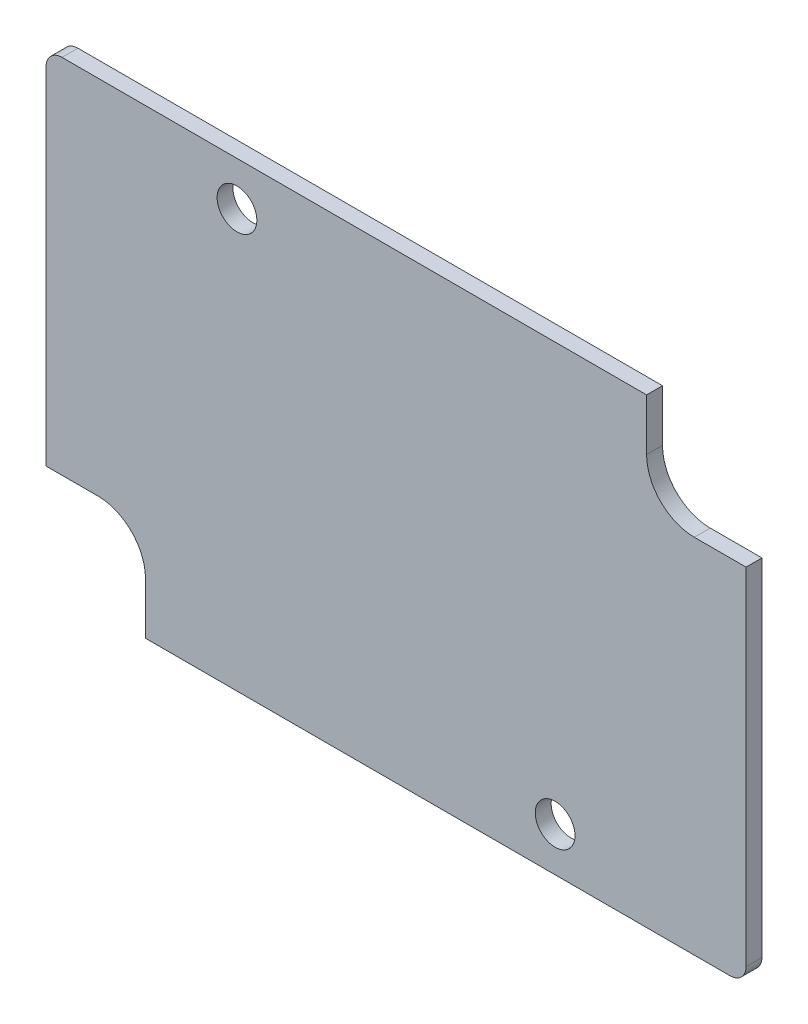
ISO-10303-21;
HEADER;
FILE_DESCRIPTION(('STEP AP214'),'2;1');
FILE_NAME('part.step','',(''),(''),'','','');
FILE_SCHEMA(('AUTOMOTIVE_DESIGN { 1 0 10303 214 1 1 1 1 }'));
ENDSEC;
DATA;
#1=APPLICATION_CONTEXT('core data for automotive mechanical design processes');
#2=APPLICATION_PROTOCOL_DEFINITION('international standard','automotive_design',2000,#1);
#3=PRODUCT_CONTEXT('',#1,'mechanical');
#4=PRODUCT('Part','Part','',(#3));
#5=PRODUCT_RELATED_PRODUCT_CATEGORY('part','',(#4));
#6=PRODUCT_DEFINITION_FORMATION('','',#4);
#7=PRODUCT_DEFINITION_CONTEXT('part definition',#1,'design');
#8=PRODUCT_DEFINITION('design','',#6,#7);
#9=PRODUCT_DEFINITION_SHAPE('','',#8);
#10=(LENGTH_UNIT() NAMED_UNIT(*) SI_UNIT(.MILLI.,.METRE.));
#11=(NAMED_UNIT(*) PLANE_ANGLE_UNIT() SI_UNIT($,.RADIAN.));
#12=(NAMED_UNIT(*) SI_UNIT($,.STERADIAN.) SOLID_ANGLE_UNIT());
#13=UNCERTAINTY_MEASURE_WITH_UNIT(LENGTH_MEASURE(1.E-05),#10,'distance_accuracy_value','');
#14=(GEOMETRIC_REPRESENTATION_CONTEXT(3) GLOBAL_UNCERTAINTY_ASSIGNED_CONTEXT((#13)) GLOBAL_UNIT_ASSIGNED_CONTEXT((#10,
#11,#12)) REPRESENTATION_CONTEXT('',''));
#15=CARTESIAN_POINT('',(0.,0.,0.));
#16=DIRECTION('',(0.,0.,1.));
#17=DIRECTION('',(1.,0.,0.));
#18=AXIS2_PLACEMENT_3D('',#15,#16,#17);
#19=CARTESIAN_POINT('',(0.,0.,1.));
#20=DIRECTION('',(0.,0.,1.));
#21=DIRECTION('',(1.,0.,0.));
#22=AXIS2_PLACEMENT_3D('',#19,#20,#21);
#23=PLANE('',#22);
#24=CARTESIAN_POINT('',(10.,-11.75,1.));
#25=DIRECTION('',(0.,0.,1.));
#26=DIRECTION('',(1.,0.,0.));
#27=AXIS2_PLACEMENT_3D('',#24,#25,#26);
#28=CIRCLE('',#27,1.25);
#29=CARTESIAN_POINT('',(11.25,-11.75,1.));
#30=VERTEX_POINT('',#29);
#31=EDGE_CURVE('E185',#30,#30,#28,.F.);
#32=ORIENTED_EDGE('',*,*,#31,.T.);
#33=EDGE_LOOP('',(#32));
#34=FACE_BOUND('',#33,.T.);
#35=CARTESIAN_POINT('',(-10.,11.75,1.));
#36=DIRECTION('',(0.,0.,1.));
#37=DIRECTION('',(1.,0.,0.));
#38=AXIS2_PLACEMENT_3D('',#35,#36,#37);
#39=CIRCLE('',#38,1.25);
#40=CARTESIAN_POINT('',(-8.75,11.75,1.));
#41=VERTEX_POINT('',#40);
#42=EDGE_CURVE('E188',#41,#41,#39,.F.);
#43=ORIENTED_EDGE('',*,*,#42,.T.);
#44=EDGE_LOOP('',(#43));
#45=FACE_BOUND('',#44,.T.);
#46=DIRECTION('',(-1.,0.,0.));
#47=VECTOR('',#46,1.);
#48=CARTESIAN_POINT('',(18.75,8.25,1.));
#49=LINE('',#48,#47);
#50=CARTESIAN_POINT('',(18.75,8.25,1.));
#51=VERTEX_POINT('',#50);
#52=CARTESIAN_POINT('',(22.,8.25,1.));
#53=VERTEX_POINT('',#52);
#54=EDGE_CURVE('E139',#51,#53,#49,.F.);
#55=ORIENTED_EDGE('',*,*,#54,.F.);
#56=CARTESIAN_POINT('',(18.75,11.25,1.));
#57=DIRECTION('',(0.,0.,1.));
#58=DIRECTION('',(1.,0.,0.));
#59=AXIS2_PLACEMENT_3D('',#56,#57,#58);
#60=CIRCLE('',#59,3.);
#61=CARTESIAN_POINT('',(15.75,11.25,1.));
#62=VERTEX_POINT('',#61);
#63=EDGE_CURVE('E136',#51,#62,#60,.F.);
#64=ORIENTED_EDGE('',*,*,#63,.T.);
#65=DIRECTION('',(0.,1.,0.));
#66=VECTOR('',#65,1.);
#67=CARTESIAN_POINT('',(15.75,14.5,1.));
#68=LINE('',#67,#66);
#69=CARTESIAN_POINT('',(15.75,14.5,1.));
#70=VERTEX_POINT('',#69);
#71=EDGE_CURVE('E134',#70,#62,#68,.F.);
#72=ORIENTED_EDGE('',*,*,#71,.F.);
#73=DIRECTION('',(1.,0.,0.));
#74=VECTOR('',#73,1.);
#75=CARTESIAN_POINT('',(-21.,14.5,1.));
#76=LINE('',#75,#74);
#77=CARTESIAN_POINT('',(-21.,14.5,1.));
#78=VERTEX_POINT('',#77);
#79=EDGE_CURVE('E116',#78,#70,#76,.T.);
#80=ORIENTED_EDGE('',*,*,#79,.F.);
#81=CARTESIAN_POINT('',(-21.,13.5,1.));
#82=DIRECTION('',(0.,0.,1.));
#83=DIRECTION('',(1.,0.,0.));
#84=AXIS2_PLACEMENT_3D('',#81,#82,#83);
#85=CIRCLE('',#84,1.);
#86=CARTESIAN_POINT('',(-22.,13.5,1.));
#87=VERTEX_POINT('',#86);
#88=EDGE_CURVE('E20',#87,#78,#85,.F.);
#89=ORIENTED_EDGE('',*,*,#88,.F.);
#90=DIRECTION('',(0.,-1.,0.));
#91=VECTOR('',#90,1.);
#92=CARTESIAN_POINT('',(-22.,-8.25,1.));
#93=LINE('',#92,#91);
#94=CARTESIAN_POINT('',(-22.,-8.25,1.));
#95=VERTEX_POINT('',#94);
#96=EDGE_CURVE('E103',#95,#87,#93,.F.);
#97=ORIENTED_EDGE('',*,*,#96,.F.);
#98=DIRECTION('',(1.,0.,0.));
#99=VECTOR('',#98,1.);
#100=CARTESIAN_POINT('',(-18.75,-8.25,1.));
#101=LINE('',#100,#99);
#102=CARTESIAN_POINT('',(-18.75,-8.25,1.));
#103=VERTEX_POINT('',#102);
#104=EDGE_CURVE('E123',#103,#95,#101,.F.);
#105=ORIENTED_EDGE('',*,*,#104,.F.);
#106=CARTESIAN_POINT('',(-18.75,-11.25,1.));
#107=DIRECTION('',(0.,0.,1.));
#108=DIRECTION('',(1.,0.,0.));
#109=AXIS2_PLACEMENT_3D('',#106,#107,#108);
#110=CIRCLE('',#109,3.);
#111=CARTESIAN_POINT('',(-15.75,-11.25,1.));
#112=VERTEX_POINT('',#111);
#113=EDGE_CURVE('E158',#103,#112,#110,.F.);
#114=ORIENTED_EDGE('',*,*,#113,.T.);
#115=DIRECTION('',(0.,-1.,0.));
#116=VECTOR('',#115,1.);
#117=CARTESIAN_POINT('',(-15.75,-14.5,1.));
#118=LINE('',#117,#116);
#119=CARTESIAN_POINT('',(-15.75,-14.5,1.));
#120=VERTEX_POINT('',#119);
#121=EDGE_CURVE('E156',#120,#112,#118,.F.);
#122=ORIENTED_EDGE('',*,*,#121,.F.);
#123=DIRECTION('',(1.,0.,0.));
#124=VECTOR('',#123,1.);
#125=CARTESIAN_POINT('',(21.,-14.5,1.));
#126=LINE('',#125,#124);
#127=CARTESIAN_POINT('',(21.,-14.5,1.));
#128=VERTEX_POINT('',#127);
#129=EDGE_CURVE('E150',#128,#120,#126,.F.);
#130=ORIENTED_EDGE('',*,*,#129,.F.);
#131=CARTESIAN_POINT('',(21.,-13.5,1.));
#132=DIRECTION('',(0.,0.,1.));
#133=DIRECTION('',(1.,0.,0.));
#134=AXIS2_PLACEMENT_3D('',#131,#132,#133);
#135=CIRCLE('',#134,1.);
#136=CARTESIAN_POINT('',(22.,-13.5,1.));
#137=VERTEX_POINT('',#136);
#138=EDGE_CURVE('E195',#137,#128,#135,.F.);
#139=ORIENTED_EDGE('',*,*,#138,.F.);
#140=DIRECTION('',(0.,1.,0.));
#141=VECTOR('',#140,1.);
#142=CARTESIAN_POINT('',(22.,8.25,1.));
#143=LINE('',#142,#141);
#144=EDGE_CURVE('E145',#53,#137,#143,.F.);
#145=ORIENTED_EDGE('',*,*,#144,.F.);
#146=EDGE_LOOP('',(#55,#64,#72,#80,#89,#97,#105,#114,#122,#130,#139,#145));
#147=FACE_BOUND('',#146,.T.);
#148=ADVANCED_FACE('F17',(#34,#45,#147),#23,.T.);
#149=CARTESIAN_POINT('',(-21.,13.5,0.));
#150=DIRECTION('',(0.,0.,1.));
#151=DIRECTION('',(1.,0.,0.));
#152=AXIS2_PLACEMENT_3D('',#149,#150,#151);
#153=CYLINDRICAL_SURFACE('',#152,1.);
#154=CARTESIAN_POINT('',(-21.,13.5,0.));
#155=DIRECTION('',(0.,0.,1.));
#156=DIRECTION('',(1.,0.,0.));
#157=AXIS2_PLACEMENT_3D('',#154,#155,#156);
#158=CIRCLE('',#157,1.);
#159=CARTESIAN_POINT('',(-21.,14.5,0.));
#160=VERTEX_POINT('',#159);
#161=CARTESIAN_POINT('',(-22.,13.5,0.));
#162=VERTEX_POINT('',#161);
#163=EDGE_CURVE('E122',#160,#162,#158,.T.);
#164=ORIENTED_EDGE('',*,*,#163,.T.);
#165=DIRECTION('',(0.,0.,1.));
#166=VECTOR('',#165,1.);
#167=CARTESIAN_POINT('',(-22.,13.5,0.));
#168=LINE('',#167,#166);
#169=EDGE_CURVE('E108',#87,#162,#168,.F.);
#170=ORIENTED_EDGE('',*,*,#169,.F.);
#171=ORIENTED_EDGE('',*,*,#88,.T.);
#172=DIRECTION('',(0.,0.,1.));
#173=VECTOR('',#172,1.);
#174=CARTESIAN_POINT('',(-21.,14.5,0.));
#175=LINE('',#174,#173);
#176=EDGE_CURVE('E191',#160,#78,#175,.T.);
#177=ORIENTED_EDGE('',*,*,#176,.F.);
#178=EDGE_LOOP('',(#164,#170,#171,#177));
#179=FACE_BOUND('',#178,.T.);
#180=ADVANCED_FACE('F121',(#179),#153,.T.);
#181=CARTESIAN_POINT('',(-22.,-8.25,0.));
#182=DIRECTION('',(-1.,0.,0.));
#183=DIRECTION('',(0.,-1.,0.));
#184=AXIS2_PLACEMENT_3D('',#181,#182,#183);
#185=PLANE('',#184);
#186=DIRECTION('',(0.,1.,0.));
#187=VECTOR('',#186,1.);
#188=CARTESIAN_POINT('',(-22.,0.,0.));
#189=LINE('',#188,#187);
#190=CARTESIAN_POINT('',(-22.,-8.25,0.));
#191=VERTEX_POINT('',#190);
#192=EDGE_CURVE('E184',#162,#191,#189,.F.);
#193=ORIENTED_EDGE('',*,*,#192,.T.);
#194=DIRECTION('',(0.,0.,1.));
#195=VECTOR('',#194,1.);
#196=CARTESIAN_POINT('',(-22.,-8.25,0.));
#197=LINE('',#196,#195);
#198=EDGE_CURVE('E110',#95,#191,#197,.F.);
#199=ORIENTED_EDGE('',*,*,#198,.F.);
#200=ORIENTED_EDGE('',*,*,#96,.T.);
#201=ORIENTED_EDGE('',*,*,#169,.T.);
#202=EDGE_LOOP('',(#193,#199,#200,#201));
#203=FACE_BOUND('',#202,.T.);
#204=ADVANCED_FACE('F106',(#203),#185,.T.);
#205=CARTESIAN_POINT('',(-18.75,-8.25,0.));
#206=DIRECTION('',(0.,-1.,0.));
#207=DIRECTION('',(1.,0.,0.));
#208=AXIS2_PLACEMENT_3D('',#205,#206,#207);
#209=PLANE('',#208);
#210=DIRECTION('',(1.,0.,0.));
#211=VECTOR('',#210,1.);
#212=CARTESIAN_POINT('',(0.,-8.25,0.));
#213=LINE('',#212,#211);
#214=CARTESIAN_POINT('',(-18.75,-8.25,0.));
#215=VERTEX_POINT('',#214);
#216=EDGE_CURVE('E182',#191,#215,#213,.T.);
#217=ORIENTED_EDGE('',*,*,#216,.T.);
#218=DIRECTION('',(0.,0.,1.));
#219=VECTOR('',#218,1.);
#220=CARTESIAN_POINT('',(-18.75,-8.25,0.));
#221=LINE('',#220,#219);
#222=EDGE_CURVE('E197',#215,#103,#221,.T.);
#223=ORIENTED_EDGE('',*,*,#222,.T.);
#224=ORIENTED_EDGE('',*,*,#104,.T.);
#225=ORIENTED_EDGE('',*,*,#198,.T.);
#226=EDGE_LOOP('',(#217,#223,#224,#225));
#227=FACE_BOUND('',#226,.T.);
#228=ADVANCED_FACE('F287',(#227),#209,.T.);
#229=CARTESIAN_POINT('',(-18.75,-11.25,0.));
#230=DIRECTION('',(0.,0.,1.));
#231=DIRECTION('',(1.,0.,0.));
#232=AXIS2_PLACEMENT_3D('',#229,#230,#231);
#233=CYLINDRICAL_SURFACE('',#232,3.);
#234=ORIENTED_EDGE('',*,*,#222,.F.);
#235=CARTESIAN_POINT('',(-18.75,-11.25,0.));
#236=DIRECTION('',(0.,0.,1.));
#237=DIRECTION('',(1.,0.,0.));
#238=AXIS2_PLACEMENT_3D('',#235,#236,#237);
#239=CIRCLE('',#238,3.);
#240=CARTESIAN_POINT('',(-15.75,-11.25,0.));
#241=VERTEX_POINT('',#240);
#242=EDGE_CURVE('E178',#215,#241,#239,.F.);
#243=ORIENTED_EDGE('',*,*,#242,.T.);
#244=DIRECTION('',(0.,0.,1.));
#245=VECTOR('',#244,1.);
#246=CARTESIAN_POINT('',(-15.75,-11.25,0.));
#247=LINE('',#246,#245);
#248=EDGE_CURVE('E153',#112,#241,#247,.F.);
#249=ORIENTED_EDGE('',*,*,#248,.F.);
#250=ORIENTED_EDGE('',*,*,#113,.F.);
#251=EDGE_LOOP('',(#234,#243,#249,#250));
#252=FACE_BOUND('',#251,.T.);
#253=ADVANCED_FACE('F285',(#252),#233,.F.);
#254=CARTESIAN_POINT('',(-15.75,-14.5,0.));
#255=DIRECTION('',(-1.,0.,0.));
#256=DIRECTION('',(0.,-1.,0.));
#257=AXIS2_PLACEMENT_3D('',#254,#255,#256);
#258=PLANE('',#257);
#259=DIRECTION('',(0.,1.,0.));
#260=VECTOR('',#259,1.);
#261=CARTESIAN_POINT('',(-15.75,0.,0.));
#262=LINE('',#261,#260);
#263=CARTESIAN_POINT('',(-15.75,-14.5,0.));
#264=VERTEX_POINT('',#263);
#265=EDGE_CURVE('E181',#241,#264,#262,.F.);
#266=ORIENTED_EDGE('',*,*,#265,.T.);
#267=DIRECTION('',(0.,0.,1.));
#268=VECTOR('',#267,1.);
#269=CARTESIAN_POINT('',(-15.75,-14.5,0.));
#270=LINE('',#269,#268);
#271=EDGE_CURVE('E152',#120,#264,#270,.F.);
#272=ORIENTED_EDGE('',*,*,#271,.F.);
#273=ORIENTED_EDGE('',*,*,#121,.T.);
#274=ORIENTED_EDGE('',*,*,#248,.T.);
#275=EDGE_LOOP('',(#266,#272,#273,#274));
#276=FACE_BOUND('',#275,.T.);
#277=ADVANCED_FACE('F283',(#276),#258,.T.);
#278=CARTESIAN_POINT('',(21.,-14.5,0.));
#279=DIRECTION('',(0.,-1.,0.));
#280=DIRECTION('',(1.,0.,0.));
#281=AXIS2_PLACEMENT_3D('',#278,#279,#280);
#282=PLANE('',#281);
#283=DIRECTION('',(1.,0.,0.));
#284=VECTOR('',#283,1.);
#285=CARTESIAN_POINT('',(0.,-14.5,0.));
#286=LINE('',#285,#284);
#287=CARTESIAN_POINT('',(21.,-14.5,0.));
#288=VERTEX_POINT('',#287);
#289=EDGE_CURVE('E177',#264,#288,#286,.T.);
#290=ORIENTED_EDGE('',*,*,#289,.T.);
#291=DIRECTION('',(0.,0.,1.));
#292=VECTOR('',#291,1.);
#293=CARTESIAN_POINT('',(21.,-14.5,0.));
#294=LINE('',#293,#292);
#295=EDGE_CURVE('E147',#128,#288,#294,.F.);
#296=ORIENTED_EDGE('',*,*,#295,.F.);
#297=ORIENTED_EDGE('',*,*,#129,.T.);
#298=ORIENTED_EDGE('',*,*,#271,.T.);
#299=EDGE_LOOP('',(#290,#296,#297,#298));
#300=FACE_BOUND('',#299,.T.);
#301=ADVANCED_FACE('F278',(#300),#282,.T.);
#302=CARTESIAN_POINT('',(21.,-13.5,0.));
#303=DIRECTION('',(0.,0.,1.));
#304=DIRECTION('',(1.,0.,0.));
#305=AXIS2_PLACEMENT_3D('',#302,#303,#304);
#306=CYLINDRICAL_SURFACE('',#305,1.);
#307=CARTESIAN_POINT('',(21.,-13.5,0.));
#308=DIRECTION('',(0.,0.,1.));
#309=DIRECTION('',(1.,0.,0.));
#310=AXIS2_PLACEMENT_3D('',#307,#308,#309);
#311=CIRCLE('',#310,1.);
#312=CARTESIAN_POINT('',(22.,-13.5,0.));
#313=VERTEX_POINT('',#312);
#314=EDGE_CURVE('E173',#288,#313,#311,.T.);
#315=ORIENTED_EDGE('',*,*,#314,.T.);
#316=DIRECTION('',(0.,0.,-1.));
#317=VECTOR('',#316,1.);
#318=CARTESIAN_POINT('',(22.,-13.5,0.));
#319=LINE('',#318,#317);
#320=EDGE_CURVE('E142',#137,#313,#319,.T.);
#321=ORIENTED_EDGE('',*,*,#320,.F.);
#322=ORIENTED_EDGE('',*,*,#138,.T.);
#323=ORIENTED_EDGE('',*,*,#295,.T.);
#324=EDGE_LOOP('',(#315,#321,#322,#323));
#325=FACE_BOUND('',#324,.T.);
#326=ADVANCED_FACE('F274',(#325),#306,.T.);
#327=CARTESIAN_POINT('',(22.,8.25,0.));
#328=DIRECTION('',(1.,0.,0.));
#329=DIRECTION('',(0.,0.,-1.));
#330=AXIS2_PLACEMENT_3D('',#327,#328,#329);
#331=PLANE('',#330);
#332=DIRECTION('',(0.,1.,0.));
#333=VECTOR('',#332,1.);
#334=CARTESIAN_POINT('',(22.,0.,0.));
#335=LINE('',#334,#333);
#336=CARTESIAN_POINT('',(22.,8.25,0.));
#337=VERTEX_POINT('',#336);
#338=EDGE_CURVE('E176',#313,#337,#335,.T.);
#339=ORIENTED_EDGE('',*,*,#338,.T.);
#340=DIRECTION('',(0.,0.,1.));
#341=VECTOR('',#340,1.);
#342=CARTESIAN_POINT('',(22.,8.25,0.));
#343=LINE('',#342,#341);
#344=EDGE_CURVE('E141',#53,#337,#343,.F.);
#345=ORIENTED_EDGE('',*,*,#344,.F.);
#346=ORIENTED_EDGE('',*,*,#144,.T.);
#347=ORIENTED_EDGE('',*,*,#320,.T.);
#348=EDGE_LOOP('',(#339,#345,#346,#347));
#349=FACE_BOUND('',#348,.T.);
#350=ADVANCED_FACE('F268',(#349),#331,.T.);
#351=CARTESIAN_POINT('',(18.75,8.25,0.));
#352=DIRECTION('',(0.,1.,0.));
#353=DIRECTION('',(-1.,0.,0.));
#354=AXIS2_PLACEMENT_3D('',#351,#352,#353);
#355=PLANE('',#354);
#356=DIRECTION('',(1.,0.,0.));
#357=VECTOR('',#356,1.);
#358=CARTESIAN_POINT('',(0.,8.25,0.));
#359=LINE('',#358,#357);
#360=CARTESIAN_POINT('',(18.75,8.25,0.));
#361=VERTEX_POINT('',#360);
#362=EDGE_CURVE('E172',#337,#361,#359,.F.);
#363=ORIENTED_EDGE('',*,*,#362,.T.);
#364=DIRECTION('',(0.,0.,1.));
#365=VECTOR('',#364,1.);
#366=CARTESIAN_POINT('',(18.75,8.25,0.));
#367=LINE('',#366,#365);
#368=EDGE_CURVE('E194',#361,#51,#367,.T.);
#369=ORIENTED_EDGE('',*,*,#368,.T.);
#370=ORIENTED_EDGE('',*,*,#54,.T.);
#371=ORIENTED_EDGE('',*,*,#344,.T.);
#372=EDGE_LOOP('',(#363,#369,#370,#371));
#373=FACE_BOUND('',#372,.T.);
#374=ADVANCED_FACE('F264',(#373),#355,.T.);
#375=CARTESIAN_POINT('',(18.75,11.25,0.));
#376=DIRECTION('',(0.,0.,1.));
#377=DIRECTION('',(1.,0.,0.));
#378=AXIS2_PLACEMENT_3D('',#375,#376,#377);
#379=CYLINDRICAL_SURFACE('',#378,3.);
#380=ORIENTED_EDGE('',*,*,#368,.F.);
#381=CARTESIAN_POINT('',(18.75,11.25,0.));
#382=DIRECTION('',(0.,0.,1.));
#383=DIRECTION('',(1.,0.,0.));
#384=AXIS2_PLACEMENT_3D('',#381,#382,#383);
#385=CIRCLE('',#384,3.);
#386=CARTESIAN_POINT('',(15.75,11.25,0.));
#387=VERTEX_POINT('',#386);
#388=EDGE_CURVE('E168',#361,#387,#385,.F.);
#389=ORIENTED_EDGE('',*,*,#388,.T.);
#390=DIRECTION('',(0.,0.,1.));
#391=VECTOR('',#390,1.);
#392=CARTESIAN_POINT('',(15.75,11.25,0.));
#393=LINE('',#392,#391);
#394=EDGE_CURVE('E131',#62,#387,#393,.F.);
#395=ORIENTED_EDGE('',*,*,#394,.F.);
#396=ORIENTED_EDGE('',*,*,#63,.F.);
#397=EDGE_LOOP('',(#380,#389,#395,#396));
#398=FACE_BOUND('',#397,.T.);
#399=ADVANCED_FACE('F260',(#398),#379,.F.);
#400=CARTESIAN_POINT('',(15.75,14.5,0.));
#401=DIRECTION('',(1.,0.,0.));
#402=DIRECTION('',(0.,1.,0.));
#403=AXIS2_PLACEMENT_3D('',#400,#401,#402);
#404=PLANE('',#403);
#405=DIRECTION('',(0.,1.,0.));
#406=VECTOR('',#405,1.);
#407=CARTESIAN_POINT('',(15.75,0.,0.));
#408=LINE('',#407,#406);
#409=CARTESIAN_POINT('',(15.75,14.5,0.));
#410=VERTEX_POINT('',#409);
#411=EDGE_CURVE('E171',#387,#410,#408,.T.);
#412=ORIENTED_EDGE('',*,*,#411,.T.);
#413=DIRECTION('',(0.,0.,1.));
#414=VECTOR('',#413,1.);
#415=CARTESIAN_POINT('',(15.75,14.5,0.));
#416=LINE('',#415,#414);
#417=EDGE_CURVE('E35',#70,#410,#416,.F.);
#418=ORIENTED_EDGE('',*,*,#417,.F.);
#419=ORIENTED_EDGE('',*,*,#71,.T.);
#420=ORIENTED_EDGE('',*,*,#394,.T.);
#421=EDGE_LOOP('',(#412,#418,#419,#420));
#422=FACE_BOUND('',#421,.T.);
#423=ADVANCED_FACE('F256',(#422),#404,.T.);
#424=CARTESIAN_POINT('',(-21.,14.5,0.));
#425=DIRECTION('',(0.,1.,0.));
#426=DIRECTION('',(0.,0.,1.));
#427=AXIS2_PLACEMENT_3D('',#424,#425,#426);
#428=PLANE('',#427);
#429=DIRECTION('',(1.,0.,0.));
#430=VECTOR('',#429,1.);
#431=CARTESIAN_POINT('',(0.,14.5,0.));
#432=LINE('',#431,#430);
#433=EDGE_CURVE('E167',#410,#160,#432,.F.);
#434=ORIENTED_EDGE('',*,*,#433,.T.);
#435=ORIENTED_EDGE('',*,*,#176,.T.);
#436=ORIENTED_EDGE('',*,*,#79,.T.);
#437=ORIENTED_EDGE('',*,*,#417,.T.);
#438=EDGE_LOOP('',(#434,#435,#436,#437));
#439=FACE_BOUND('',#438,.T.);
#440=ADVANCED_FACE('F250',(#439),#428,.T.);
#441=CARTESIAN_POINT('',(-10.,11.75,-51.7067358124178));
#442=DIRECTION('',(0.,0.,1.));
#443=DIRECTION('',(1.,0.,0.));
#444=AXIS2_PLACEMENT_3D('',#441,#442,#443);
#445=CYLINDRICAL_SURFACE('',#444,1.25);
#446=ORIENTED_EDGE('',*,*,#42,.F.);
#447=EDGE_LOOP('',(#446));
#448=FACE_BOUND('',#447,.T.);
#449=CARTESIAN_POINT('',(-10.,11.75,0.));
#450=DIRECTION('',(0.,0.,1.));
#451=DIRECTION('',(1.,0.,0.));
#452=AXIS2_PLACEMENT_3D('',#449,#450,#451);
#453=CIRCLE('',#452,1.25);
#454=CARTESIAN_POINT('',(-8.75,11.75,0.));
#455=VERTEX_POINT('',#454);
#456=EDGE_CURVE('E26',#455,#455,#453,.F.);
#457=ORIENTED_EDGE('',*,*,#456,.T.);
#458=EDGE_LOOP('',(#457));
#459=FACE_BOUND('',#458,.T.);
#460=ADVANCED_FACE('F304',(#448,#459),#445,.F.);
#461=CARTESIAN_POINT('',(10.,-11.75,-51.7067358124178));
#462=DIRECTION('',(0.,0.,1.));
#463=DIRECTION('',(1.,0.,0.));
#464=AXIS2_PLACEMENT_3D('',#461,#462,#463);
#465=CYLINDRICAL_SURFACE('',#464,1.25);
#466=ORIENTED_EDGE('',*,*,#31,.F.);
#467=EDGE_LOOP('',(#466));
#468=FACE_BOUND('',#467,.T.);
#469=CARTESIAN_POINT('',(10.,-11.75,0.));
#470=DIRECTION('',(0.,0.,1.));
#471=DIRECTION('',(1.,0.,0.));
#472=AXIS2_PLACEMENT_3D('',#469,#470,#471);
#473=CIRCLE('',#472,1.25);
#474=CARTESIAN_POINT('',(11.25,-11.75,0.));
#475=VERTEX_POINT('',#474);
#476=EDGE_CURVE('E11',#475,#475,#473,.F.);
#477=ORIENTED_EDGE('',*,*,#476,.T.);
#478=EDGE_LOOP('',(#477));
#479=FACE_BOUND('',#478,.T.);
#480=ADVANCED_FACE('F298',(#468,#479),#465,.F.);
#481=CARTESIAN_POINT('',(0.,0.,0.));
#482=DIRECTION('',(0.,0.,1.));
#483=DIRECTION('',(1.,0.,0.));
#484=AXIS2_PLACEMENT_3D('',#481,#482,#483);
#485=PLANE('',#484);
#486=ORIENTED_EDGE('',*,*,#476,.F.);
#487=EDGE_LOOP('',(#486));
#488=FACE_BOUND('',#487,.T.);
#489=ORIENTED_EDGE('',*,*,#456,.F.);
#490=EDGE_LOOP('',(#489));
#491=FACE_BOUND('',#490,.T.);
#492=ORIENTED_EDGE('',*,*,#411,.F.);
#493=ORIENTED_EDGE('',*,*,#388,.F.);
#494=ORIENTED_EDGE('',*,*,#362,.F.);
#495=ORIENTED_EDGE('',*,*,#338,.F.);
#496=ORIENTED_EDGE('',*,*,#314,.F.);
#497=ORIENTED_EDGE('',*,*,#289,.F.);
#498=ORIENTED_EDGE('',*,*,#265,.F.);
#499=ORIENTED_EDGE('',*,*,#242,.F.);
#500=ORIENTED_EDGE('',*,*,#216,.F.);
#501=ORIENTED_EDGE('',*,*,#192,.F.);
#502=ORIENTED_EDGE('',*,*,#163,.F.);
#503=ORIENTED_EDGE('',*,*,#433,.F.);
#504=EDGE_LOOP('',(#492,#493,#494,#495,#496,#497,#498,#499,#500,#501,#502,#503));
#505=FACE_BOUND('',#504,.T.);
#506=ADVANCED_FACE('F253',(#488,#491,#505),#485,.F.);
#507=CLOSED_SHELL('',(#148,#180,#204,#228,#253,#277,#301,#326,#350,#374,#399,#423,#440,#460,
#480,#506));
#508=MANIFOLD_SOLID_BREP('B1',#507);
#509=ADVANCED_BREP_SHAPE_REPRESENTATION('',(#18,#508),#14);
#510=SHAPE_DEFINITION_REPRESENTATION(#9,#509);
ENDSEC;
END-ISO-10303-21;
